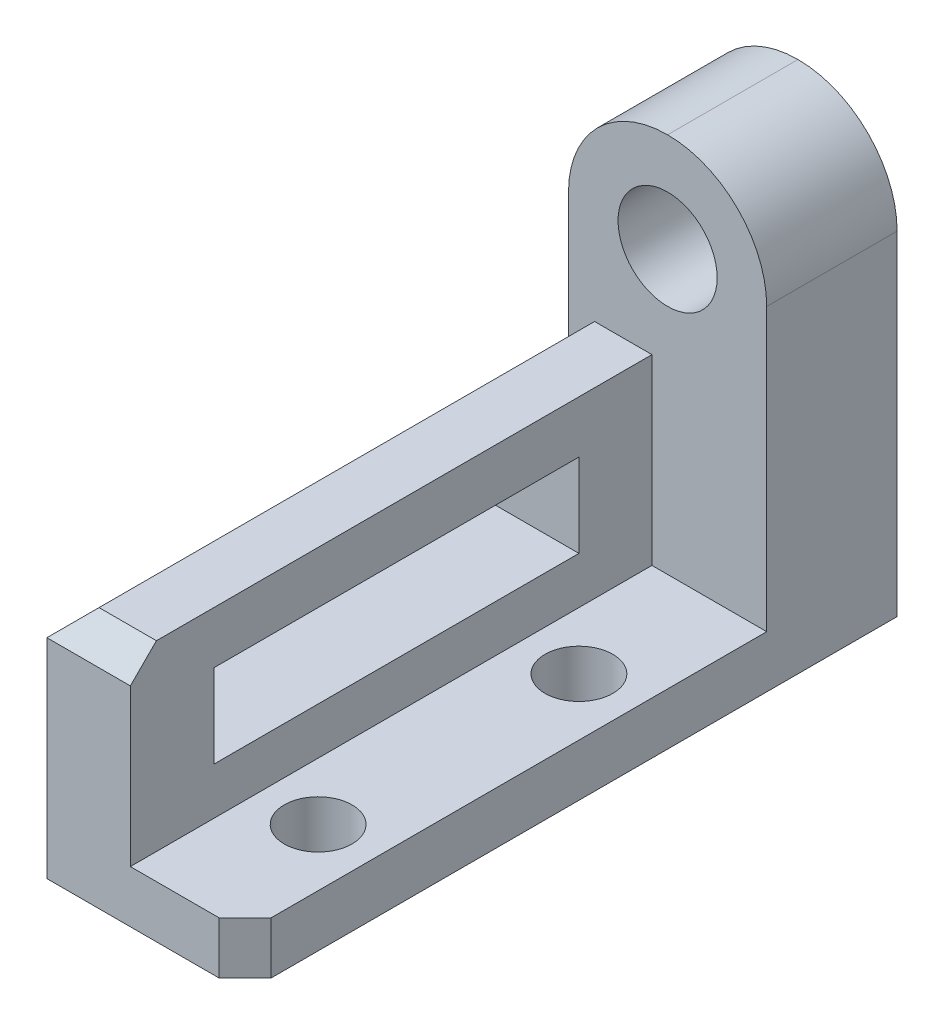
ISO-10303-21;
HEADER;
FILE_DESCRIPTION(('STEP AP214'),'2;1');
FILE_NAME('part.step','',(''),(''),'','','');
FILE_SCHEMA(('AUTOMOTIVE_DESIGN { 1 0 10303 214 1 1 1 1 }'));
ENDSEC;
DATA;
#1=APPLICATION_CONTEXT('core data for automotive mechanical design processes');
#2=APPLICATION_PROTOCOL_DEFINITION('international standard','automotive_design',2000,#1);
#3=PRODUCT_CONTEXT('',#1,'mechanical');
#4=PRODUCT('Part','Part','',(#3));
#5=PRODUCT_RELATED_PRODUCT_CATEGORY('part','',(#4));
#6=PRODUCT_DEFINITION_FORMATION('','',#4);
#7=PRODUCT_DEFINITION_CONTEXT('part definition',#1,'design');
#8=PRODUCT_DEFINITION('design','',#6,#7);
#9=PRODUCT_DEFINITION_SHAPE('','',#8);
#10=(LENGTH_UNIT() NAMED_UNIT(*) SI_UNIT(.MILLI.,.METRE.));
#11=(NAMED_UNIT(*) PLANE_ANGLE_UNIT() SI_UNIT($,.RADIAN.));
#12=(NAMED_UNIT(*) SI_UNIT($,.STERADIAN.) SOLID_ANGLE_UNIT());
#13=UNCERTAINTY_MEASURE_WITH_UNIT(LENGTH_MEASURE(1.E-05),#10,'distance_accuracy_value','');
#14=(GEOMETRIC_REPRESENTATION_CONTEXT(3) GLOBAL_UNCERTAINTY_ASSIGNED_CONTEXT((#13)) GLOBAL_UNIT_ASSIGNED_CONTEXT((#10,
#11,#12)) REPRESENTATION_CONTEXT('',''));
#15=CARTESIAN_POINT('',(0.,0.,0.));
#16=DIRECTION('',(0.,0.,1.));
#17=DIRECTION('',(1.,0.,0.));
#18=AXIS2_PLACEMENT_3D('',#15,#16,#17);
#19=CARTESIAN_POINT('',(-19.,10.,-37.5));
#20=DIRECTION('',(0.,1.,0.));
#21=DIRECTION('',(0.,0.,1.));
#22=AXIS2_PLACEMENT_3D('',#19,#20,#21);
#23=PLANE('',#22);
#24=CARTESIAN_POINT('',(8.,10.,-12.5));
#25=DIRECTION('',(0.,1.,0.));
#26=DIRECTION('',(0.,0.,1.));
#27=AXIS2_PLACEMENT_3D('',#24,#25,#26);
#28=CIRCLE('',#27,6.50000000000001);
#29=CARTESIAN_POINT('',(8.,10.,-5.99999999999999));
#30=VERTEX_POINT('',#29);
#31=EDGE_CURVE('E585',#30,#30,#28,.T.);
#32=ORIENTED_EDGE('',*,*,#31,.F.);
#33=EDGE_LOOP('',(#32));
#34=FACE_BOUND('',#33,.T.);
#35=CARTESIAN_POINT('',(8.,10.,37.5));
#36=DIRECTION('',(0.,1.,0.));
#37=DIRECTION('',(0.,0.,1.));
#38=AXIS2_PLACEMENT_3D('',#35,#36,#37);
#39=CIRCLE('',#38,6.50000000000001);
#40=CARTESIAN_POINT('',(8.,10.,44.));
#41=VERTEX_POINT('',#40);
#42=EDGE_CURVE('E589',#41,#41,#39,.T.);
#43=ORIENTED_EDGE('',*,*,#42,.F.);
#44=EDGE_LOOP('',(#43));
#45=FACE_BOUND('',#44,.T.);
#46=DIRECTION('',(1.,0.,0.));
#47=VECTOR('',#46,1.);
#48=CARTESIAN_POINT('',(-19.,10.,62.5));
#49=LINE('',#48,#47);
#50=CARTESIAN_POINT('',(-2.99999999999999,10.,62.5));
#51=VERTEX_POINT('',#50);
#52=CARTESIAN_POINT('',(14.,10.,62.5));
#53=VERTEX_POINT('',#52);
#54=EDGE_CURVE('E264',#51,#53,#49,.T.);
#55=ORIENTED_EDGE('',*,*,#54,.T.);
#56=DIRECTION('',(-0.707106781186548,0.,0.707106781186548));
#57=VECTOR('',#56,1.);
#58=CARTESIAN_POINT('',(47.5,10.,29.));
#59=LINE('',#58,#57);
#60=CARTESIAN_POINT('',(19.,10.,57.5));
#61=VERTEX_POINT('',#60);
#62=EDGE_CURVE('E11',#53,#61,#59,.F.);
#63=ORIENTED_EDGE('',*,*,#62,.T.);
#64=DIRECTION('',(0.,0.,1.));
#65=VECTOR('',#64,1.);
#66=CARTESIAN_POINT('',(19.,10.,-37.5));
#67=LINE('',#66,#65);
#68=CARTESIAN_POINT('',(19.,10.,-37.5));
#69=VERTEX_POINT('',#68);
#70=EDGE_CURVE('E245',#69,#61,#67,.T.);
#71=ORIENTED_EDGE('',*,*,#70,.F.);
#72=DIRECTION('',(1.,0.,0.));
#73=VECTOR('',#72,1.);
#74=CARTESIAN_POINT('',(-19.,10.,-37.5));
#75=LINE('',#74,#73);
#76=CARTESIAN_POINT('',(-2.99999999999999,10.,-37.5));
#77=VERTEX_POINT('',#76);
#78=EDGE_CURVE('E269',#77,#69,#75,.T.);
#79=ORIENTED_EDGE('',*,*,#78,.F.);
#80=DIRECTION('',(0.,0.,-1.));
#81=VECTOR('',#80,1.);
#82=CARTESIAN_POINT('',(-2.99999999999999,10.,100.983762809788));
#83=LINE('',#82,#81);
#84=EDGE_CURVE('E226',#51,#77,#83,.T.);
#85=ORIENTED_EDGE('',*,*,#84,.F.);
#86=EDGE_LOOP('',(#55,#63,#71,#79,#85));
#87=FACE_BOUND('',#86,.T.);
#88=ADVANCED_FACE('F47',(#34,#45,#87),#23,.T.);
#89=CARTESIAN_POINT('',(-19.,83.,-37.5));
#90=DIRECTION('',(0.,0.,1.));
#91=DIRECTION('',(0.,-1.,0.));
#92=AXIS2_PLACEMENT_3D('',#89,#90,#91);
#93=PLANE('',#92);
#94=CARTESIAN_POINT('',(0.,64.,-37.5));
#95=DIRECTION('',(0.,0.,1.));
#96=DIRECTION('',(1.,0.,0.));
#97=AXIS2_PLACEMENT_3D('',#94,#95,#96);
#98=CIRCLE('',#97,9.50000000000001);
#99=CARTESIAN_POINT('',(9.50000000000001,64.,-37.5));
#100=VERTEX_POINT('',#99);
#101=EDGE_CURVE('E207',#100,#100,#98,.T.);
#102=ORIENTED_EDGE('',*,*,#101,.F.);
#103=EDGE_LOOP('',(#102));
#104=FACE_BOUND('',#103,.T.);
#105=CARTESIAN_POINT('',(0.,64.,-37.5));
#106=DIRECTION('',(0.,0.,1.));
#107=DIRECTION('',(0.,-1.,0.));
#108=AXIS2_PLACEMENT_3D('',#105,#106,#107);
#109=CIRCLE('',#108,19.);
#110=CARTESIAN_POINT('',(19.,64.,-37.5));
#111=VERTEX_POINT('',#110);
#112=CARTESIAN_POINT('',(0.,83.,-37.5));
#113=VERTEX_POINT('',#112);
#114=EDGE_CURVE('E268',#111,#113,#109,.T.);
#115=ORIENTED_EDGE('',*,*,#114,.T.);
#116=CARTESIAN_POINT('',(0.,64.,-37.5));
#117=DIRECTION('',(0.,0.,1.));
#118=DIRECTION('',(0.,-1.,0.));
#119=AXIS2_PLACEMENT_3D('',#116,#117,#118);
#120=CIRCLE('',#119,19.);
#121=CARTESIAN_POINT('',(-19.,64.,-37.5));
#122=VERTEX_POINT('',#121);
#123=EDGE_CURVE('E282',#113,#122,#120,.T.);
#124=ORIENTED_EDGE('',*,*,#123,.T.);
#125=DIRECTION('',(0.,-1.,0.));
#126=VECTOR('',#125,1.);
#127=CARTESIAN_POINT('',(-19.,83.,-37.5));
#128=LINE('',#127,#126);
#129=CARTESIAN_POINT('',(-19.,40.,-37.5));
#130=VERTEX_POINT('',#129);
#131=EDGE_CURVE('E260',#122,#130,#128,.T.);
#132=ORIENTED_EDGE('',*,*,#131,.T.);
#133=DIRECTION('',(-0.707106781186547,-0.707106781186548,0.));
#134=VECTOR('',#133,1.);
#135=CARTESIAN_POINT('',(-19.,40.,-37.5));
#136=LINE('',#135,#134);
#137=CARTESIAN_POINT('',(-14.,45.,-37.5));
#138=VERTEX_POINT('',#137);
#139=EDGE_CURVE('E317',#130,#138,#136,.F.);
#140=ORIENTED_EDGE('',*,*,#139,.T.);
#141=DIRECTION('',(-1.,0.,0.));
#142=VECTOR('',#141,1.);
#143=CARTESIAN_POINT('',(-19.,45.,-37.5));
#144=LINE('',#143,#142);
#145=CARTESIAN_POINT('',(-3.,45.,-37.5));
#146=VERTEX_POINT('',#145);
#147=EDGE_CURVE('E216',#146,#138,#144,.T.);
#148=ORIENTED_EDGE('',*,*,#147,.F.);
#149=DIRECTION('',(0.,1.,0.));
#150=VECTOR('',#149,1.);
#151=CARTESIAN_POINT('',(-3.,45.,-37.5));
#152=LINE('',#151,#150);
#153=EDGE_CURVE('E222',#77,#146,#152,.T.);
#154=ORIENTED_EDGE('',*,*,#153,.F.);
#155=ORIENTED_EDGE('',*,*,#78,.T.);
#156=DIRECTION('',(0.,-1.,0.));
#157=VECTOR('',#156,1.);
#158=CARTESIAN_POINT('',(19.,83.,-37.5));
#159=LINE('',#158,#157);
#160=EDGE_CURVE('E242',#111,#69,#159,.T.);
#161=ORIENTED_EDGE('',*,*,#160,.F.);
#162=EDGE_LOOP('',(#115,#124,#132,#140,#148,#154,#155,#161));
#163=FACE_BOUND('',#162,.T.);
#164=ADVANCED_FACE('F361',(#104,#163),#93,.T.);
#165=CARTESIAN_POINT('',(-19.,10.,62.5));
#166=DIRECTION('',(0.,0.,1.));
#167=DIRECTION('',(1.,0.,0.));
#168=AXIS2_PLACEMENT_3D('',#165,#166,#167);
#169=PLANE('',#168);
#170=DIRECTION('',(1.,0.,0.));
#171=VECTOR('',#170,1.);
#172=CARTESIAN_POINT('',(-19.,0.,62.5));
#173=LINE('',#172,#171);
#174=CARTESIAN_POINT('',(-19.,0.,62.5));
#175=VERTEX_POINT('',#174);
#176=CARTESIAN_POINT('',(14.,0.,62.5));
#177=VERTEX_POINT('',#176);
#178=EDGE_CURVE('E263',#175,#177,#173,.T.);
#179=ORIENTED_EDGE('',*,*,#178,.T.);
#180=DIRECTION('',(0.,1.,0.));
#181=VECTOR('',#180,1.);
#182=CARTESIAN_POINT('',(14.,10.,62.5));
#183=LINE('',#182,#181);
#184=EDGE_CURVE('E57',#177,#53,#183,.T.);
#185=ORIENTED_EDGE('',*,*,#184,.T.);
#186=ORIENTED_EDGE('',*,*,#54,.F.);
#187=DIRECTION('',(0.,1.,0.));
#188=VECTOR('',#187,1.);
#189=CARTESIAN_POINT('',(-3.,45.,62.5));
#190=LINE('',#189,#188);
#191=CARTESIAN_POINT('',(-2.99999999999999,40.,62.5));
#192=VERTEX_POINT('',#191);
#193=EDGE_CURVE('E220',#51,#192,#190,.T.);
#194=ORIENTED_EDGE('',*,*,#193,.T.);
#195=DIRECTION('',(-1.,0.,0.));
#196=VECTOR('',#195,1.);
#197=CARTESIAN_POINT('',(-19.,40.,62.5));
#198=LINE('',#197,#196);
#199=CARTESIAN_POINT('',(-19.,40.,62.5));
#200=VERTEX_POINT('',#199);
#201=EDGE_CURVE('E311',#192,#200,#198,.T.);
#202=ORIENTED_EDGE('',*,*,#201,.T.);
#203=DIRECTION('',(0.,-1.,0.));
#204=VECTOR('',#203,1.);
#205=CARTESIAN_POINT('',(-19.,10.,62.5));
#206=LINE('',#205,#204);
#207=EDGE_CURVE('E249',#200,#175,#206,.T.);
#208=ORIENTED_EDGE('',*,*,#207,.T.);
#209=EDGE_LOOP('',(#179,#185,#186,#194,#202,#208));
#210=FACE_BOUND('',#209,.T.);
#211=ADVANCED_FACE('F333',(#210),#169,.T.);
#212=CARTESIAN_POINT('',(-19.,0.,-62.5));
#213=DIRECTION('',(0.,0.,-1.));
#214=DIRECTION('',(-1.,0.,0.));
#215=AXIS2_PLACEMENT_3D('',#212,#213,#214);
#216=PLANE('',#215);
#217=CARTESIAN_POINT('',(0.,64.,-62.5));
#218=DIRECTION('',(0.,0.,1.));
#219=DIRECTION('',(1.,0.,0.));
#220=AXIS2_PLACEMENT_3D('',#217,#218,#219);
#221=CIRCLE('',#220,9.50000000000001);
#222=CARTESIAN_POINT('',(9.50000000000001,64.,-62.5));
#223=VERTEX_POINT('',#222);
#224=EDGE_CURVE('E211',#223,#223,#221,.T.);
#225=ORIENTED_EDGE('',*,*,#224,.T.);
#226=EDGE_LOOP('',(#225));
#227=FACE_BOUND('',#226,.T.);
#228=DIRECTION('',(0.,1.,0.));
#229=VECTOR('',#228,1.);
#230=CARTESIAN_POINT('',(-19.,0.,-62.5));
#231=LINE('',#230,#229);
#232=CARTESIAN_POINT('',(-19.,0.,-62.5));
#233=VERTEX_POINT('',#232);
#234=CARTESIAN_POINT('',(-19.,64.,-62.5));
#235=VERTEX_POINT('',#234);
#236=EDGE_CURVE('E256',#233,#235,#231,.T.);
#237=ORIENTED_EDGE('',*,*,#236,.T.);
#238=CARTESIAN_POINT('',(0.,64.,-62.5));
#239=DIRECTION('',(0.,0.,-1.));
#240=DIRECTION('',(-1.,0.,0.));
#241=AXIS2_PLACEMENT_3D('',#238,#239,#240);
#242=CIRCLE('',#241,19.);
#243=CARTESIAN_POINT('',(0.,83.,-62.5));
#244=VERTEX_POINT('',#243);
#245=EDGE_CURVE('E292',#235,#244,#242,.T.);
#246=ORIENTED_EDGE('',*,*,#245,.T.);
#247=CARTESIAN_POINT('',(0.,64.,-62.5));
#248=DIRECTION('',(0.,0.,-1.));
#249=DIRECTION('',(-1.,0.,0.));
#250=AXIS2_PLACEMENT_3D('',#247,#248,#249);
#251=CIRCLE('',#250,19.);
#252=CARTESIAN_POINT('',(19.,64.,-62.5));
#253=VERTEX_POINT('',#252);
#254=EDGE_CURVE('E289',#244,#253,#251,.T.);
#255=ORIENTED_EDGE('',*,*,#254,.T.);
#256=DIRECTION('',(0.,1.,0.));
#257=VECTOR('',#256,1.);
#258=CARTESIAN_POINT('',(19.,0.,-62.5));
#259=LINE('',#258,#257);
#260=CARTESIAN_POINT('',(19.,0.,-62.5));
#261=VERTEX_POINT('',#260);
#262=EDGE_CURVE('E238',#261,#253,#259,.T.);
#263=ORIENTED_EDGE('',*,*,#262,.F.);
#264=DIRECTION('',(1.,0.,0.));
#265=VECTOR('',#264,1.);
#266=CARTESIAN_POINT('',(-19.,0.,-62.5));
#267=LINE('',#266,#265);
#268=EDGE_CURVE('E273',#233,#261,#267,.T.);
#269=ORIENTED_EDGE('',*,*,#268,.F.);
#270=EDGE_LOOP('',(#237,#246,#255,#263,#269));
#271=FACE_BOUND('',#270,.T.);
#272=ADVANCED_FACE('F351',(#227,#271),#216,.T.);
#273=CARTESIAN_POINT('',(-19.,0.,62.5));
#274=DIRECTION('',(0.,-1.,0.));
#275=DIRECTION('',(0.,0.,-1.));
#276=AXIS2_PLACEMENT_3D('',#273,#274,#275);
#277=PLANE('',#276);
#278=CARTESIAN_POINT('',(8.,0.,-12.5));
#279=DIRECTION('',(0.,1.,0.));
#280=DIRECTION('',(0.,0.,1.));
#281=AXIS2_PLACEMENT_3D('',#278,#279,#280);
#282=CIRCLE('',#281,6.50000000000001);
#283=CARTESIAN_POINT('',(8.,0.,-5.99999999999999));
#284=VERTEX_POINT('',#283);
#285=EDGE_CURVE('E583',#284,#284,#282,.T.);
#286=ORIENTED_EDGE('',*,*,#285,.T.);
#287=EDGE_LOOP('',(#286));
#288=FACE_BOUND('',#287,.T.);
#289=CARTESIAN_POINT('',(8.,0.,37.5));
#290=DIRECTION('',(0.,1.,0.));
#291=DIRECTION('',(0.,0.,1.));
#292=AXIS2_PLACEMENT_3D('',#289,#290,#291);
#293=CIRCLE('',#292,6.50000000000001);
#294=CARTESIAN_POINT('',(8.,0.,44.));
#295=VERTEX_POINT('',#294);
#296=EDGE_CURVE('E595',#295,#295,#293,.T.);
#297=ORIENTED_EDGE('',*,*,#296,.T.);
#298=EDGE_LOOP('',(#297));
#299=FACE_BOUND('',#298,.T.);
#300=DIRECTION('',(0.,0.,-1.));
#301=VECTOR('',#300,1.);
#302=CARTESIAN_POINT('',(19.,0.,62.5));
#303=LINE('',#302,#301);
#304=CARTESIAN_POINT('',(19.,0.,57.5));
#305=VERTEX_POINT('',#304);
#306=EDGE_CURVE('E230',#305,#261,#303,.T.);
#307=ORIENTED_EDGE('',*,*,#306,.F.);
#308=DIRECTION('',(0.707106781186548,0.,-0.707106781186548));
#309=VECTOR('',#308,1.);
#310=CARTESIAN_POINT('',(-2.50000000000001,0.,79.));
#311=LINE('',#310,#309);
#312=EDGE_CURVE('E327',#305,#177,#311,.F.);
#313=ORIENTED_EDGE('',*,*,#312,.T.);
#314=ORIENTED_EDGE('',*,*,#178,.F.);
#315=DIRECTION('',(0.,0.,-1.));
#316=VECTOR('',#315,1.);
#317=CARTESIAN_POINT('',(-19.,0.,62.5));
#318=LINE('',#317,#316);
#319=EDGE_CURVE('E252',#175,#233,#318,.T.);
#320=ORIENTED_EDGE('',*,*,#319,.T.);
#321=ORIENTED_EDGE('',*,*,#268,.T.);
#322=EDGE_LOOP('',(#307,#313,#314,#320,#321));
#323=FACE_BOUND('',#322,.T.);
#324=ADVANCED_FACE('F346',(#288,#299,#323),#277,.T.);
#325=CARTESIAN_POINT('',(-19.,0.,0.));
#326=DIRECTION('',(1.,0.,0.));
#327=DIRECTION('',(0.,0.,-1.));
#328=AXIS2_PLACEMENT_3D('',#325,#326,#327);
#329=PLANE('',#328);
#330=DIRECTION('',(0.,0.,1.));
#331=VECTOR('',#330,1.);
#332=CARTESIAN_POINT('',(-19.,35.,0.));
#333=LINE('',#332,#331);
#334=CARTESIAN_POINT('',(-19.,35.,-23.5));
#335=VERTEX_POINT('',#334);
#336=CARTESIAN_POINT('',(-19.,35.,46.5));
#337=VERTEX_POINT('',#336);
#338=EDGE_CURVE('E198',#335,#337,#333,.T.);
#339=ORIENTED_EDGE('',*,*,#338,.T.);
#340=DIRECTION('',(0.,-1.,0.));
#341=VECTOR('',#340,1.);
#342=CARTESIAN_POINT('',(-19.,0.,46.5));
#343=LINE('',#342,#341);
#344=CARTESIAN_POINT('',(-19.,19.,46.5));
#345=VERTEX_POINT('',#344);
#346=EDGE_CURVE('E202',#337,#345,#343,.T.);
#347=ORIENTED_EDGE('',*,*,#346,.T.);
#348=DIRECTION('',(0.,0.,-1.));
#349=VECTOR('',#348,1.);
#350=CARTESIAN_POINT('',(-19.,19.,0.));
#351=LINE('',#350,#349);
#352=CARTESIAN_POINT('',(-19.,19.,-23.5));
#353=VERTEX_POINT('',#352);
#354=EDGE_CURVE('E189',#345,#353,#351,.T.);
#355=ORIENTED_EDGE('',*,*,#354,.T.);
#356=DIRECTION('',(0.,1.,0.));
#357=VECTOR('',#356,1.);
#358=CARTESIAN_POINT('',(-19.,0.,-23.5));
#359=LINE('',#358,#357);
#360=EDGE_CURVE('E164',#353,#335,#359,.T.);
#361=ORIENTED_EDGE('',*,*,#360,.T.);
#362=EDGE_LOOP('',(#339,#347,#355,#361));
#363=FACE_BOUND('',#362,.T.);
#364=ORIENTED_EDGE('',*,*,#207,.F.);
#365=DIRECTION('',(0.,0.,-1.));
#366=VECTOR('',#365,1.);
#367=CARTESIAN_POINT('',(-19.,40.,0.));
#368=LINE('',#367,#366);
#369=EDGE_CURVE('E298',#200,#130,#368,.T.);
#370=ORIENTED_EDGE('',*,*,#369,.T.);
#371=ORIENTED_EDGE('',*,*,#131,.F.);
#372=DIRECTION('',(0.,0.,1.));
#373=VECTOR('',#372,1.);
#374=CARTESIAN_POINT('',(-19.,64.,-62.5));
#375=LINE('',#374,#373);
#376=EDGE_CURVE('E285',#122,#235,#375,.F.);
#377=ORIENTED_EDGE('',*,*,#376,.T.);
#378=ORIENTED_EDGE('',*,*,#236,.F.);
#379=ORIENTED_EDGE('',*,*,#319,.F.);
#380=EDGE_LOOP('',(#364,#370,#371,#377,#378,#379));
#381=FACE_BOUND('',#380,.T.);
#382=ADVANCED_FACE('F378',(#363,#381),#329,.F.);
#383=CARTESIAN_POINT('',(19.,0.,0.));
#384=DIRECTION('',(1.,0.,0.));
#385=DIRECTION('',(0.,0.,-1.));
#386=AXIS2_PLACEMENT_3D('',#383,#384,#385);
#387=PLANE('',#386);
#388=ORIENTED_EDGE('',*,*,#70,.T.);
#389=DIRECTION('',(0.,-1.,0.));
#390=VECTOR('',#389,1.);
#391=CARTESIAN_POINT('',(19.,0.,57.5));
#392=LINE('',#391,#390);
#393=EDGE_CURVE('E320',#61,#305,#392,.T.);
#394=ORIENTED_EDGE('',*,*,#393,.T.);
#395=ORIENTED_EDGE('',*,*,#306,.T.);
#396=ORIENTED_EDGE('',*,*,#262,.T.);
#397=DIRECTION('',(0.,0.,1.));
#398=VECTOR('',#397,1.);
#399=CARTESIAN_POINT('',(19.,64.,0.));
#400=LINE('',#399,#398);
#401=EDGE_CURVE('E295',#253,#111,#400,.T.);
#402=ORIENTED_EDGE('',*,*,#401,.T.);
#403=ORIENTED_EDGE('',*,*,#160,.T.);
#404=EDGE_LOOP('',(#388,#394,#395,#396,#402,#403));
#405=FACE_BOUND('',#404,.T.);
#406=ADVANCED_FACE('F344',(#405),#387,.T.);
#407=CARTESIAN_POINT('',(-3.,45.,100.983762809788));
#408=DIRECTION('',(-1.,0.,0.));
#409=DIRECTION('',(0.,-1.,0.));
#410=AXIS2_PLACEMENT_3D('',#407,#408,#409);
#411=PLANE('',#410);
#412=DIRECTION('',(0.,0.,-1.));
#413=VECTOR('',#412,1.);
#414=CARTESIAN_POINT('',(-2.99999999999999,19.,46.5));
#415=LINE('',#414,#413);
#416=CARTESIAN_POINT('',(-2.99999999999999,19.,46.5));
#417=VERTEX_POINT('',#416);
#418=CARTESIAN_POINT('',(-2.99999999999999,19.,-23.5));
#419=VERTEX_POINT('',#418);
#420=EDGE_CURVE('E171',#417,#419,#415,.T.);
#421=ORIENTED_EDGE('',*,*,#420,.F.);
#422=DIRECTION('',(0.,-1.,0.));
#423=VECTOR('',#422,1.);
#424=CARTESIAN_POINT('',(-2.99999999999999,35.,46.5));
#425=LINE('',#424,#423);
#426=CARTESIAN_POINT('',(-2.99999999999999,35.,46.5));
#427=VERTEX_POINT('',#426);
#428=EDGE_CURVE('E72',#427,#417,#425,.T.);
#429=ORIENTED_EDGE('',*,*,#428,.F.);
#430=DIRECTION('',(0.,0.,1.));
#431=VECTOR('',#430,1.);
#432=CARTESIAN_POINT('',(-2.99999999999999,35.,46.5));
#433=LINE('',#432,#431);
#434=CARTESIAN_POINT('',(-2.99999999999999,35.,-23.5));
#435=VERTEX_POINT('',#434);
#436=EDGE_CURVE('E179',#435,#427,#433,.T.);
#437=ORIENTED_EDGE('',*,*,#436,.F.);
#438=DIRECTION('',(0.,1.,0.));
#439=VECTOR('',#438,1.);
#440=CARTESIAN_POINT('',(-2.99999999999999,35.,-23.5));
#441=LINE('',#440,#439);
#442=EDGE_CURVE('E161',#419,#435,#441,.T.);
#443=ORIENTED_EDGE('',*,*,#442,.F.);
#444=EDGE_LOOP('',(#421,#429,#437,#443));
#445=FACE_BOUND('',#444,.T.);
#446=DIRECTION('',(0.,0.,-1.));
#447=VECTOR('',#446,1.);
#448=CARTESIAN_POINT('',(-3.,45.,100.983762809788));
#449=LINE('',#448,#447);
#450=CARTESIAN_POINT('',(-3.,45.,57.5));
#451=VERTEX_POINT('',#450);
#452=EDGE_CURVE('E221',#451,#146,#449,.T.);
#453=ORIENTED_EDGE('',*,*,#452,.F.);
#454=DIRECTION('',(0.,-0.707106781186549,0.707106781186547));
#455=VECTOR('',#454,1.);
#456=CARTESIAN_POINT('',(-3.,40.,62.5));
#457=LINE('',#456,#455);
#458=EDGE_CURVE('E314',#451,#192,#457,.T.);
#459=ORIENTED_EDGE('',*,*,#458,.T.);
#460=ORIENTED_EDGE('',*,*,#193,.F.);
#461=ORIENTED_EDGE('',*,*,#84,.T.);
#462=ORIENTED_EDGE('',*,*,#153,.T.);
#463=EDGE_LOOP('',(#453,#459,#460,#461,#462));
#464=FACE_BOUND('',#463,.T.);
#465=ADVANCED_FACE('F176',(#445,#464),#411,.F.);
#466=CARTESIAN_POINT('',(-19.,45.,100.983762809788));
#467=DIRECTION('',(0.,-1.,0.));
#468=DIRECTION('',(1.,0.,0.));
#469=AXIS2_PLACEMENT_3D('',#466,#467,#468);
#470=PLANE('',#469);
#471=ORIENTED_EDGE('',*,*,#147,.T.);
#472=DIRECTION('',(0.,0.,1.));
#473=VECTOR('',#472,1.);
#474=CARTESIAN_POINT('',(-14.,45.,100.983762809788));
#475=LINE('',#474,#473);
#476=CARTESIAN_POINT('',(-14.,45.,57.5));
#477=VERTEX_POINT('',#476);
#478=EDGE_CURVE('E308',#138,#477,#475,.T.);
#479=ORIENTED_EDGE('',*,*,#478,.T.);
#480=DIRECTION('',(1.,0.,0.));
#481=VECTOR('',#480,1.);
#482=CARTESIAN_POINT('',(-3.,45.,57.5));
#483=LINE('',#482,#481);
#484=EDGE_CURVE('E305',#477,#451,#483,.T.);
#485=ORIENTED_EDGE('',*,*,#484,.T.);
#486=ORIENTED_EDGE('',*,*,#452,.T.);
#487=EDGE_LOOP('',(#471,#479,#485,#486));
#488=FACE_BOUND('',#487,.T.);
#489=ADVANCED_FACE('F392',(#488),#470,.F.);
#490=CARTESIAN_POINT('',(0.,64.,0.));
#491=DIRECTION('',(0.,0.,1.));
#492=DIRECTION('',(1.,0.,0.));
#493=AXIS2_PLACEMENT_3D('',#490,#491,#492);
#494=CYLINDRICAL_SURFACE('',#493,19.);
#495=ORIENTED_EDGE('',*,*,#401,.F.);
#496=ORIENTED_EDGE('',*,*,#254,.F.);
#497=DIRECTION('',(0.,0.,1.));
#498=VECTOR('',#497,1.);
#499=CARTESIAN_POINT('',(0.,83.,-62.5));
#500=LINE('',#499,#498);
#501=EDGE_CURVE('E215',#113,#244,#500,.F.);
#502=ORIENTED_EDGE('',*,*,#501,.F.);
#503=ORIENTED_EDGE('',*,*,#114,.F.);
#504=EDGE_LOOP('',(#495,#496,#502,#503));
#505=FACE_BOUND('',#504,.T.);
#506=ADVANCED_FACE('F357',(#505),#494,.T.);
#507=CARTESIAN_POINT('',(0.,64.,-62.5));
#508=DIRECTION('',(0.,0.,-1.));
#509=DIRECTION('',(-1.,0.,0.));
#510=AXIS2_PLACEMENT_3D('',#507,#508,#509);
#511=CYLINDRICAL_SURFACE('',#510,19.);
#512=ORIENTED_EDGE('',*,*,#245,.F.);
#513=ORIENTED_EDGE('',*,*,#376,.F.);
#514=ORIENTED_EDGE('',*,*,#123,.F.);
#515=ORIENTED_EDGE('',*,*,#501,.T.);
#516=EDGE_LOOP('',(#512,#513,#514,#515));
#517=FACE_BOUND('',#516,.T.);
#518=ADVANCED_FACE('F381',(#517),#511,.T.);
#519=CARTESIAN_POINT('',(0.,64.,-37.5));
#520=DIRECTION('',(0.,0.,1.));
#521=DIRECTION('',(1.,0.,0.));
#522=AXIS2_PLACEMENT_3D('',#519,#520,#521);
#523=CYLINDRICAL_SURFACE('',#522,9.50000000000001);
#524=ORIENTED_EDGE('',*,*,#224,.F.);
#525=EDGE_LOOP('',(#524));
#526=FACE_BOUND('',#525,.T.);
#527=ORIENTED_EDGE('',*,*,#101,.T.);
#528=EDGE_LOOP('',(#527));
#529=FACE_BOUND('',#528,.T.);
#530=ADVANCED_FACE('F383',(#526,#529),#523,.F.);
#531=CARTESIAN_POINT('',(-19.,40.,62.5));
#532=DIRECTION('',(0.,0.707106781186547,0.707106781186549));
#533=DIRECTION('',(1.,0.,0.));
#534=AXIS2_PLACEMENT_3D('',#531,#532,#533);
#535=PLANE('',#534);
#536=ORIENTED_EDGE('',*,*,#458,.F.);
#537=ORIENTED_EDGE('',*,*,#484,.F.);
#538=DIRECTION('',(0.577350269189626,0.577350269189626,-0.577350269189625));
#539=VECTOR('',#538,1.);
#540=CARTESIAN_POINT('',(-19.,40.,62.5));
#541=LINE('',#540,#539);
#542=EDGE_CURVE('E206',#200,#477,#541,.T.);
#543=ORIENTED_EDGE('',*,*,#542,.F.);
#544=ORIENTED_EDGE('',*,*,#201,.F.);
#545=EDGE_LOOP('',(#536,#537,#543,#544));
#546=FACE_BOUND('',#545,.T.);
#547=ADVANCED_FACE('F370',(#546),#535,.T.);
#548=CARTESIAN_POINT('',(-19.,40.,0.));
#549=DIRECTION('',(0.707106781186548,-0.707106781186547,0.));
#550=DIRECTION('',(0.,0.,-1.));
#551=AXIS2_PLACEMENT_3D('',#548,#549,#550);
#552=PLANE('',#551);
#553=ORIENTED_EDGE('',*,*,#542,.T.);
#554=ORIENTED_EDGE('',*,*,#478,.F.);
#555=ORIENTED_EDGE('',*,*,#139,.F.);
#556=ORIENTED_EDGE('',*,*,#369,.F.);
#557=EDGE_LOOP('',(#553,#554,#555,#556));
#558=FACE_BOUND('',#557,.T.);
#559=ADVANCED_FACE('F376',(#558),#552,.F.);
#560=CARTESIAN_POINT('',(19.,0.,57.5));
#561=DIRECTION('',(-0.707106781186547,0.,-0.707106781186547));
#562=DIRECTION('',(0.,-1.,0.));
#563=AXIS2_PLACEMENT_3D('',#560,#561,#562);
#564=PLANE('',#563);
#565=ORIENTED_EDGE('',*,*,#62,.F.);
#566=ORIENTED_EDGE('',*,*,#184,.F.);
#567=ORIENTED_EDGE('',*,*,#312,.F.);
#568=ORIENTED_EDGE('',*,*,#393,.F.);
#569=EDGE_LOOP('',(#565,#566,#567,#568));
#570=FACE_BOUND('',#569,.T.);
#571=ADVANCED_FACE('F50',(#570),#564,.F.);
#572=CARTESIAN_POINT('',(-22.,35.,46.5));
#573=DIRECTION('',(0.,0.,1.));
#574=DIRECTION('',(1.,0.,0.));
#575=AXIS2_PLACEMENT_3D('',#572,#573,#574);
#576=PLANE('',#575);
#577=DIRECTION('',(1.,0.,0.));
#578=VECTOR('',#577,1.);
#579=CARTESIAN_POINT('',(-22.,35.,46.5));
#580=LINE('',#579,#578);
#581=EDGE_CURVE('E186',#337,#427,#580,.T.);
#582=ORIENTED_EDGE('',*,*,#581,.T.);
#583=ORIENTED_EDGE('',*,*,#428,.T.);
#584=DIRECTION('',(1.,0.,0.));
#585=VECTOR('',#584,1.);
#586=CARTESIAN_POINT('',(-22.,19.,46.5));
#587=LINE('',#586,#585);
#588=EDGE_CURVE('E168',#345,#417,#587,.T.);
#589=ORIENTED_EDGE('',*,*,#588,.F.);
#590=ORIENTED_EDGE('',*,*,#346,.F.);
#591=EDGE_LOOP('',(#582,#583,#589,#590));
#592=FACE_BOUND('',#591,.T.);
#593=ADVANCED_FACE('F437',(#592),#576,.F.);
#594=CARTESIAN_POINT('',(-22.,35.,46.5));
#595=DIRECTION('',(0.,1.,0.));
#596=DIRECTION('',(-1.,0.,0.));
#597=AXIS2_PLACEMENT_3D('',#594,#595,#596);
#598=PLANE('',#597);
#599=DIRECTION('',(1.,0.,0.));
#600=VECTOR('',#599,1.);
#601=CARTESIAN_POINT('',(-22.,35.,-23.5));
#602=LINE('',#601,#600);
#603=EDGE_CURVE('E167',#335,#435,#602,.T.);
#604=ORIENTED_EDGE('',*,*,#603,.T.);
#605=ORIENTED_EDGE('',*,*,#436,.T.);
#606=ORIENTED_EDGE('',*,*,#581,.F.);
#607=ORIENTED_EDGE('',*,*,#338,.F.);
#608=EDGE_LOOP('',(#604,#605,#606,#607));
#609=FACE_BOUND('',#608,.T.);
#610=ADVANCED_FACE('F457',(#609),#598,.F.);
#611=CARTESIAN_POINT('',(-22.,35.,-23.5));
#612=DIRECTION('',(0.,0.,-1.));
#613=DIRECTION('',(0.,1.,0.));
#614=AXIS2_PLACEMENT_3D('',#611,#612,#613);
#615=PLANE('',#614);
#616=DIRECTION('',(1.,0.,0.));
#617=VECTOR('',#616,1.);
#618=CARTESIAN_POINT('',(-22.,19.,-23.5));
#619=LINE('',#618,#617);
#620=EDGE_CURVE('E64',#353,#419,#619,.T.);
#621=ORIENTED_EDGE('',*,*,#620,.T.);
#622=ORIENTED_EDGE('',*,*,#442,.T.);
#623=ORIENTED_EDGE('',*,*,#603,.F.);
#624=ORIENTED_EDGE('',*,*,#360,.F.);
#625=EDGE_LOOP('',(#621,#622,#623,#624));
#626=FACE_BOUND('',#625,.T.);
#627=ADVANCED_FACE('F158',(#626),#615,.F.);
#628=CARTESIAN_POINT('',(-22.,19.,46.5));
#629=DIRECTION('',(0.,-1.,0.));
#630=DIRECTION('',(1.,0.,0.));
#631=AXIS2_PLACEMENT_3D('',#628,#629,#630);
#632=PLANE('',#631);
#633=ORIENTED_EDGE('',*,*,#588,.T.);
#634=ORIENTED_EDGE('',*,*,#420,.T.);
#635=ORIENTED_EDGE('',*,*,#620,.F.);
#636=ORIENTED_EDGE('',*,*,#354,.F.);
#637=EDGE_LOOP('',(#633,#634,#635,#636));
#638=FACE_BOUND('',#637,.T.);
#639=ADVANCED_FACE('F172',(#638),#632,.F.);
#640=CARTESIAN_POINT('',(8.,10.,37.5));
#641=DIRECTION('',(0.,1.,0.));
#642=DIRECTION('',(0.,0.,1.));
#643=AXIS2_PLACEMENT_3D('',#640,#641,#642);
#644=CYLINDRICAL_SURFACE('',#643,6.50000000000001);
#645=ORIENTED_EDGE('',*,*,#296,.F.);
#646=EDGE_LOOP('',(#645));
#647=FACE_BOUND('',#646,.T.);
#648=ORIENTED_EDGE('',*,*,#42,.T.);
#649=EDGE_LOOP('',(#648));
#650=FACE_BOUND('',#649,.T.);
#651=ADVANCED_FACE('F478',(#647,#650),#644,.F.);
#652=CARTESIAN_POINT('',(8.,10.,-12.5));
#653=DIRECTION('',(0.,1.,0.));
#654=DIRECTION('',(0.,0.,1.));
#655=AXIS2_PLACEMENT_3D('',#652,#653,#654);
#656=CYLINDRICAL_SURFACE('',#655,6.50000000000001);
#657=ORIENTED_EDGE('',*,*,#285,.F.);
#658=EDGE_LOOP('',(#657));
#659=FACE_BOUND('',#658,.T.);
#660=ORIENTED_EDGE('',*,*,#31,.T.);
#661=EDGE_LOOP('',(#660));
#662=FACE_BOUND('',#661,.T.);
#663=ADVANCED_FACE('F490',(#659,#662),#656,.F.);
#664=CLOSED_SHELL('',(#88,#164,#211,#272,#324,#382,#406,#465,#489,#506,#518,#530,#547,#559,#571,
#593,#610,#627,#639,#651,#663));
#665=MANIFOLD_SOLID_BREP('B2',#664);
#666=ADVANCED_BREP_SHAPE_REPRESENTATION('',(#18,#665),#14);
#667=SHAPE_DEFINITION_REPRESENTATION(#9,#666);
ENDSEC;
END-ISO-10303-21;
